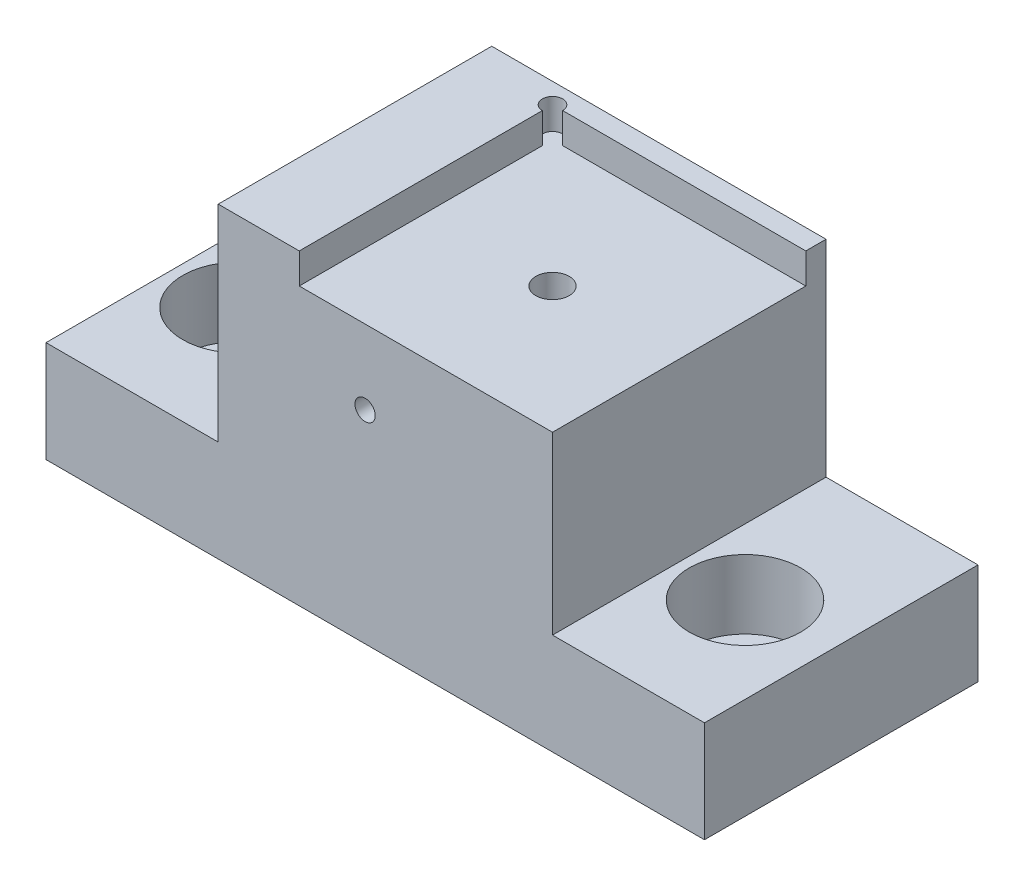
ISO-10303-21;
HEADER;
FILE_DESCRIPTION(('STEP AP214'),'2;1');
FILE_NAME('part.step','',(''),(''),'','','');
FILE_SCHEMA(('AUTOMOTIVE_DESIGN { 1 0 10303 214 1 1 1 1 }'));
ENDSEC;
DATA;
#1=APPLICATION_CONTEXT('core data for automotive mechanical design processes');
#2=APPLICATION_PROTOCOL_DEFINITION('international standard','automotive_design',2000,#1);
#3=PRODUCT_CONTEXT('',#1,'mechanical');
#4=PRODUCT('Part','Part','',(#3));
#5=PRODUCT_RELATED_PRODUCT_CATEGORY('part','',(#4));
#6=PRODUCT_DEFINITION_FORMATION('','',#4);
#7=PRODUCT_DEFINITION_CONTEXT('part definition',#1,'design');
#8=PRODUCT_DEFINITION('design','',#6,#7);
#9=PRODUCT_DEFINITION_SHAPE('','',#8);
#10=(LENGTH_UNIT() NAMED_UNIT(*) SI_UNIT(.MILLI.,.METRE.));
#11=(NAMED_UNIT(*) PLANE_ANGLE_UNIT() SI_UNIT($,.RADIAN.));
#12=(NAMED_UNIT(*) SI_UNIT($,.STERADIAN.) SOLID_ANGLE_UNIT());
#13=UNCERTAINTY_MEASURE_WITH_UNIT(LENGTH_MEASURE(1.E-05),#10,'distance_accuracy_value','');
#14=(GEOMETRIC_REPRESENTATION_CONTEXT(3) GLOBAL_UNCERTAINTY_ASSIGNED_CONTEXT((#13)) GLOBAL_UNIT_ASSIGNED_CONTEXT((#10,
#11,#12)) REPRESENTATION_CONTEXT('',''));
#15=CARTESIAN_POINT('',(0.,0.,0.));
#16=DIRECTION('',(0.,0.,1.));
#17=DIRECTION('',(1.,0.,0.));
#18=AXIS2_PLACEMENT_3D('',#15,#16,#17);
#19=CARTESIAN_POINT('',(-14.5,5.,-14.5));
#20=DIRECTION('',(0.,0.,1.));
#21=DIRECTION('',(1.,0.,0.));
#22=AXIS2_PLACEMENT_3D('',#19,#20,#21);
#23=PLANE('',#22);
#24=DIRECTION('',(1.,0.,0.));
#25=VECTOR('',#24,1.);
#26=CARTESIAN_POINT('',(14.5,-25.3411677323979,-14.5));
#27=LINE('',#26,#25);
#28=CARTESIAN_POINT('',(-37.5,-25.3411677323979,-14.5));
#29=VERTEX_POINT('',#28);
#30=CARTESIAN_POINT('',(27.5,-25.3411677323979,-14.5));
#31=VERTEX_POINT('',#30);
#32=EDGE_CURVE('E360',#29,#31,#27,.T.);
#33=ORIENTED_EDGE('',*,*,#32,.F.);
#34=DIRECTION('',(0.,-1.,0.));
#35=VECTOR('',#34,1.);
#36=CARTESIAN_POINT('',(-37.5,-15.3411677323979,-14.5));
#37=LINE('',#36,#35);
#38=CARTESIAN_POINT('',(-37.5,-15.3411677323979,-14.5));
#39=VERTEX_POINT('',#38);
#40=EDGE_CURVE('E249',#39,#29,#37,.T.);
#41=ORIENTED_EDGE('',*,*,#40,.F.);
#42=DIRECTION('',(-1.,0.,0.));
#43=VECTOR('',#42,1.);
#44=CARTESIAN_POINT('',(34.,-15.3411677323979,-14.5));
#45=LINE('',#44,#43);
#46=CARTESIAN_POINT('',(-20.5,-15.3411677323979,-14.5));
#47=VERTEX_POINT('',#46);
#48=EDGE_CURVE('E301',#47,#39,#45,.T.);
#49=ORIENTED_EDGE('',*,*,#48,.F.);
#50=DIRECTION('',(0.,1.,0.));
#51=VECTOR('',#50,1.);
#52=CARTESIAN_POINT('',(-20.5,-70.794440441852,-14.5));
#53=LINE('',#52,#51);
#54=CARTESIAN_POINT('',(-20.5,5.,-14.5));
#55=VERTEX_POINT('',#54);
#56=EDGE_CURVE('E359',#47,#55,#53,.T.);
#57=ORIENTED_EDGE('',*,*,#56,.T.);
#58=DIRECTION('',(-1.,0.,0.));
#59=VECTOR('',#58,1.);
#60=CARTESIAN_POINT('',(-14.5,5.,-14.5));
#61=LINE('',#60,#59);
#62=CARTESIAN_POINT('',(12.5,5.,-14.5));
#63=VERTEX_POINT('',#62);
#64=EDGE_CURVE('E50',#63,#55,#61,.T.);
#65=ORIENTED_EDGE('',*,*,#64,.F.);
#66=DIRECTION('',(0.,1.,0.));
#67=VECTOR('',#66,1.);
#68=CARTESIAN_POINT('',(12.5,-25.3411677323979,-14.5));
#69=LINE('',#68,#67);
#70=CARTESIAN_POINT('',(12.5,-15.3411677323979,-14.5));
#71=VERTEX_POINT('',#70);
#72=EDGE_CURVE('E331',#71,#63,#69,.T.);
#73=ORIENTED_EDGE('',*,*,#72,.F.);
#74=CARTESIAN_POINT('',(27.5,-15.3411677323979,-14.5));
#75=VERTEX_POINT('',#74);
#76=EDGE_CURVE('E302',#75,#71,#45,.T.);
#77=ORIENTED_EDGE('',*,*,#76,.F.);
#78=DIRECTION('',(0.,1.,0.));
#79=VECTOR('',#78,1.);
#80=CARTESIAN_POINT('',(27.5,-25.3411677323979,-14.5));
#81=LINE('',#80,#79);
#82=EDGE_CURVE('E66',#31,#75,#81,.T.);
#83=ORIENTED_EDGE('',*,*,#82,.F.);
#84=EDGE_LOOP('',(#33,#41,#49,#57,#65,#73,#77,#83));
#85=FACE_BOUND('',#84,.T.);
#86=ADVANCED_FACE('F42',(#85),#23,.F.);
#87=CARTESIAN_POINT('',(-20.5,-25.3411677323979,12.5));
#88=DIRECTION('',(0.,0.,-1.));
#89=DIRECTION('',(-1.,0.,0.));
#90=AXIS2_PLACEMENT_3D('',#87,#88,#89);
#91=PLANE('',#90);
#92=CARTESIAN_POINT('',(-6.,-5.34116773239792,12.5));
#93=DIRECTION('',(0.,0.,1.));
#94=DIRECTION('',(1.,0.,0.));
#95=AXIS2_PLACEMENT_3D('',#92,#93,#94);
#96=CIRCLE('',#95,1.0000000000003);
#97=CARTESIAN_POINT('',(-4.9999999999997,-5.34116773239792,12.5));
#98=VERTEX_POINT('',#97);
#99=EDGE_CURVE('E257',#98,#98,#96,.T.);
#100=ORIENTED_EDGE('',*,*,#99,.F.);
#101=EDGE_LOOP('',(#100));
#102=FACE_BOUND('',#101,.T.);
#103=DIRECTION('',(0.,1.,0.));
#104=VECTOR('',#103,1.);
#105=CARTESIAN_POINT('',(-37.5,-25.3411677323979,12.5));
#106=LINE('',#105,#104);
#107=CARTESIAN_POINT('',(-37.5,-25.3411677323979,12.5));
#108=VERTEX_POINT('',#107);
#109=CARTESIAN_POINT('',(-37.5,-15.3411677323979,12.5));
#110=VERTEX_POINT('',#109);
#111=EDGE_CURVE('E255',#108,#110,#106,.T.);
#112=ORIENTED_EDGE('',*,*,#111,.F.);
#113=DIRECTION('',(-1.,0.,0.));
#114=VECTOR('',#113,1.);
#115=CARTESIAN_POINT('',(-20.5,-25.3411677323979,12.5));
#116=LINE('',#115,#114);
#117=CARTESIAN_POINT('',(27.5,-25.3411677323979,12.5));
#118=VERTEX_POINT('',#117);
#119=EDGE_CURVE('E329',#118,#108,#116,.T.);
#120=ORIENTED_EDGE('',*,*,#119,.F.);
#121=DIRECTION('',(0.,-1.,0.));
#122=VECTOR('',#121,1.);
#123=CARTESIAN_POINT('',(27.5,-15.3411677323979,12.5));
#124=LINE('',#123,#122);
#125=CARTESIAN_POINT('',(27.5,-15.3411677323979,12.5));
#126=VERTEX_POINT('',#125);
#127=EDGE_CURVE('E239',#126,#118,#124,.T.);
#128=ORIENTED_EDGE('',*,*,#127,.F.);
#129=DIRECTION('',(-1.,0.,0.));
#130=VECTOR('',#129,1.);
#131=CARTESIAN_POINT('',(-46.,-15.3411677323979,12.5));
#132=LINE('',#131,#130);
#133=CARTESIAN_POINT('',(12.5,-15.3411677323979,12.5));
#134=VERTEX_POINT('',#133);
#135=EDGE_CURVE('E323',#126,#134,#132,.T.);
#136=ORIENTED_EDGE('',*,*,#135,.T.);
#137=DIRECTION('',(0.,1.,0.));
#138=VECTOR('',#137,1.);
#139=CARTESIAN_POINT('',(12.5,-25.3411677323979,12.5));
#140=LINE('',#139,#138);
#141=CARTESIAN_POINT('',(12.5,2.,12.5));
#142=VERTEX_POINT('',#141);
#143=EDGE_CURVE('E339',#134,#142,#140,.T.);
#144=ORIENTED_EDGE('',*,*,#143,.T.);
#145=DIRECTION('',(-1.,0.,0.));
#146=VECTOR('',#145,1.);
#147=CARTESIAN_POINT('',(-12.5,2.,12.5));
#148=LINE('',#147,#146);
#149=CARTESIAN_POINT('',(-12.5,2.,12.5));
#150=VERTEX_POINT('',#149);
#151=EDGE_CURVE('E367',#142,#150,#148,.T.);
#152=ORIENTED_EDGE('',*,*,#151,.T.);
#153=DIRECTION('',(0.,1.,0.));
#154=VECTOR('',#153,1.);
#155=CARTESIAN_POINT('',(-12.5,2.,12.5));
#156=LINE('',#155,#154);
#157=CARTESIAN_POINT('',(-12.5,5.,12.5));
#158=VERTEX_POINT('',#157);
#159=EDGE_CURVE('E383',#150,#158,#156,.T.);
#160=ORIENTED_EDGE('',*,*,#159,.T.);
#161=DIRECTION('',(-1.,0.,0.));
#162=VECTOR('',#161,1.);
#163=CARTESIAN_POINT('',(-20.5,5.,12.5));
#164=LINE('',#163,#162);
#165=CARTESIAN_POINT('',(-20.5,5.,12.5));
#166=VERTEX_POINT('',#165);
#167=EDGE_CURVE('E332',#158,#166,#164,.T.);
#168=ORIENTED_EDGE('',*,*,#167,.T.);
#169=DIRECTION('',(0.,1.,0.));
#170=VECTOR('',#169,1.);
#171=CARTESIAN_POINT('',(-20.5,-25.3411677323979,12.5));
#172=LINE('',#171,#170);
#173=CARTESIAN_POINT('',(-20.5,-15.3411677323979,12.5));
#174=VERTEX_POINT('',#173);
#175=EDGE_CURVE('E336',#174,#166,#172,.T.);
#176=ORIENTED_EDGE('',*,*,#175,.F.);
#177=EDGE_CURVE('E326',#174,#110,#132,.T.);
#178=ORIENTED_EDGE('',*,*,#177,.T.);
#179=EDGE_LOOP('',(#112,#120,#128,#136,#144,#152,#160,#168,#176,#178));
#180=FACE_BOUND('',#179,.T.);
#181=ADVANCED_FACE('F393',(#102,#180),#91,.F.);
#182=CARTESIAN_POINT('',(0.,-15.3411677323979,0.));
#183=DIRECTION('',(0.,-1.,0.));
#184=DIRECTION('',(0.,0.,-1.));
#185=AXIS2_PLACEMENT_3D('',#182,#183,#184);
#186=PLANE('',#185);
#187=CARTESIAN_POINT('',(19.,-15.3411677323979,0.));
#188=DIRECTION('',(0.,1.,0.));
#189=DIRECTION('',(0.,0.,1.));
#190=AXIS2_PLACEMENT_3D('',#187,#188,#189);
#191=CIRCLE('',#190,5.5);
#192=CARTESIAN_POINT('',(19.,-15.3411677323979,5.5));
#193=VERTEX_POINT('',#192);
#194=EDGE_CURVE('E313',#193,#193,#191,.T.);
#195=ORIENTED_EDGE('',*,*,#194,.F.);
#196=EDGE_LOOP('',(#195));
#197=FACE_BOUND('',#196,.T.);
#198=DIRECTION('',(0.,0.,1.));
#199=VECTOR('',#198,1.);
#200=CARTESIAN_POINT('',(27.5,-15.3411677323979,-14.5));
#201=LINE('',#200,#199);
#202=EDGE_CURVE('E245',#75,#126,#201,.T.);
#203=ORIENTED_EDGE('',*,*,#202,.F.);
#204=ORIENTED_EDGE('',*,*,#76,.T.);
#205=DIRECTION('',(0.,0.,1.));
#206=VECTOR('',#205,1.);
#207=CARTESIAN_POINT('',(12.5,-15.3411677323979,12.5));
#208=LINE('',#207,#206);
#209=EDGE_CURVE('E11',#71,#134,#208,.T.);
#210=ORIENTED_EDGE('',*,*,#209,.T.);
#211=ORIENTED_EDGE('',*,*,#135,.F.);
#212=EDGE_LOOP('',(#203,#204,#210,#211));
#213=FACE_BOUND('',#212,.T.);
#214=ADVANCED_FACE('F420',(#197,#213),#186,.F.);
#215=CARTESIAN_POINT('',(-6.0032,-25.3411677323979,-0.00319999999999834));
#216=DIRECTION('',(0.,-1.,0.));
#217=DIRECTION('',(0.,0.,-1.));
#218=AXIS2_PLACEMENT_3D('',#215,#216,#217);
#219=PLANE('',#218);
#220=DIRECTION('',(0.,0.,1.));
#221=VECTOR('',#220,1.);
#222=CARTESIAN_POINT('',(-37.5,-25.3411677323979,-14.5));
#223=LINE('',#222,#221);
#224=EDGE_CURVE('E252',#29,#108,#223,.T.);
#225=ORIENTED_EDGE('',*,*,#224,.F.);
#226=ORIENTED_EDGE('',*,*,#32,.T.);
#227=DIRECTION('',(0.,0.,-1.));
#228=VECTOR('',#227,1.);
#229=CARTESIAN_POINT('',(27.5,-25.3411677323979,12.5));
#230=LINE('',#229,#228);
#231=EDGE_CURVE('E242',#118,#31,#230,.T.);
#232=ORIENTED_EDGE('',*,*,#231,.F.);
#233=ORIENTED_EDGE('',*,*,#119,.T.);
#234=EDGE_LOOP('',(#225,#226,#232,#233));
#235=FACE_BOUND('',#234,.T.);
#236=CARTESIAN_POINT('',(-21.,-25.3411677323979,8.));
#237=DIRECTION('',(0.,-1.,0.));
#238=DIRECTION('',(0.,0.,-1.));
#239=AXIS2_PLACEMENT_3D('',#236,#237,#238);
#240=CIRCLE('',#239,1.99999999999999);
#241=CARTESIAN_POINT('',(-21.,-25.3411677323979,6.00000000000001));
#242=VERTEX_POINT('',#241);
#243=EDGE_CURVE('E203',#242,#242,#240,.T.);
#244=ORIENTED_EDGE('',*,*,#243,.F.);
#245=EDGE_LOOP('',(#244));
#246=FACE_BOUND('',#245,.T.);
#247=CARTESIAN_POINT('',(-21.,-25.3411677323979,-8.));
#248=DIRECTION('',(0.,-1.,0.));
#249=DIRECTION('',(0.,0.,-1.));
#250=AXIS2_PLACEMENT_3D('',#247,#248,#249);
#251=CIRCLE('',#250,2.);
#252=CARTESIAN_POINT('',(-21.,-25.3411677323979,-10.));
#253=VERTEX_POINT('',#252);
#254=EDGE_CURVE('E202',#253,#253,#251,.T.);
#255=ORIENTED_EDGE('',*,*,#254,.F.);
#256=EDGE_LOOP('',(#255));
#257=FACE_BOUND('',#256,.T.);
#258=CARTESIAN_POINT('',(-21.,-25.3411677323979,0.));
#259=DIRECTION('',(0.,-1.,0.));
#260=DIRECTION('',(0.,0.,-1.));
#261=AXIS2_PLACEMENT_3D('',#258,#259,#260);
#262=CIRCLE('',#261,2.);
#263=CARTESIAN_POINT('',(-21.,-25.3411677323979,-2.));
#264=VERTEX_POINT('',#263);
#265=EDGE_CURVE('E289',#264,#264,#262,.T.);
#266=ORIENTED_EDGE('',*,*,#265,.F.);
#267=EDGE_LOOP('',(#266));
#268=FACE_BOUND('',#267,.T.);
#269=CARTESIAN_POINT('',(-31.,-25.3411677323979,0.));
#270=DIRECTION('',(0.,-1.,0.));
#271=DIRECTION('',(0.,0.,-1.));
#272=AXIS2_PLACEMENT_3D('',#269,#270,#271);
#273=CIRCLE('',#272,3.3);
#274=CARTESIAN_POINT('',(-31.,-25.3411677323979,-3.3));
#275=VERTEX_POINT('',#274);
#276=EDGE_CURVE('E45',#275,#275,#273,.T.);
#277=ORIENTED_EDGE('',*,*,#276,.F.);
#278=EDGE_LOOP('',(#277));
#279=FACE_BOUND('',#278,.T.);
#280=CARTESIAN_POINT('',(8.5,-25.3411677323979,-8.));
#281=DIRECTION('',(0.,-1.,0.));
#282=DIRECTION('',(0.,0.,-1.));
#283=AXIS2_PLACEMENT_3D('',#280,#281,#282);
#284=CIRCLE('',#283,2.);
#285=CARTESIAN_POINT('',(8.5,-25.3411677323979,-6.));
#286=VERTEX_POINT('',#285);
#287=CARTESIAN_POINT('',(8.5,-25.3411677323979,-10.));
#288=VERTEX_POINT('',#287);
#289=EDGE_CURVE('E58',#286,#288,#284,.T.);
#290=ORIENTED_EDGE('',*,*,#289,.F.);
#291=DIRECTION('',(-1.,0.,0.));
#292=VECTOR('',#291,1.);
#293=CARTESIAN_POINT('',(8.5,-25.3411677323979,-6.));
#294=LINE('',#293,#292);
#295=CARTESIAN_POINT('',(9.5,-25.3411677323979,-6.));
#296=VERTEX_POINT('',#295);
#297=EDGE_CURVE('E228',#296,#286,#294,.T.);
#298=ORIENTED_EDGE('',*,*,#297,.F.);
#299=CARTESIAN_POINT('',(9.5,-25.3411677323979,-8.));
#300=DIRECTION('',(0.,-1.,0.));
#301=DIRECTION('',(0.,0.,-1.));
#302=AXIS2_PLACEMENT_3D('',#299,#300,#301);
#303=CIRCLE('',#302,2.);
#304=CARTESIAN_POINT('',(9.5,-25.3411677323979,-10.));
#305=VERTEX_POINT('',#304);
#306=EDGE_CURVE('E225',#305,#296,#303,.T.);
#307=ORIENTED_EDGE('',*,*,#306,.F.);
#308=DIRECTION('',(1.,0.,0.));
#309=VECTOR('',#308,1.);
#310=CARTESIAN_POINT('',(8.5,-25.3411677323979,-10.));
#311=LINE('',#310,#309);
#312=EDGE_CURVE('E222',#288,#305,#311,.T.);
#313=ORIENTED_EDGE('',*,*,#312,.F.);
#314=EDGE_LOOP('',(#290,#298,#307,#313));
#315=FACE_BOUND('',#314,.T.);
#316=CARTESIAN_POINT('',(19.,-25.3411677323979,0.));
#317=DIRECTION('',(0.,-1.,0.));
#318=DIRECTION('',(0.,0.,-1.));
#319=AXIS2_PLACEMENT_3D('',#316,#317,#318);
#320=CIRCLE('',#319,3.3);
#321=CARTESIAN_POINT('',(19.,-25.3411677323979,-3.3));
#322=VERTEX_POINT('',#321);
#323=EDGE_CURVE('E322',#322,#322,#320,.T.);
#324=ORIENTED_EDGE('',*,*,#323,.F.);
#325=EDGE_LOOP('',(#324));
#326=FACE_BOUND('',#325,.T.);
#327=CARTESIAN_POINT('',(8.5,-25.3411677323979,0.));
#328=DIRECTION('',(0.,-1.,0.));
#329=DIRECTION('',(0.,0.,-1.));
#330=AXIS2_PLACEMENT_3D('',#327,#328,#329);
#331=CIRCLE('',#330,2.);
#332=CARTESIAN_POINT('',(8.5,-25.3411677323979,2.));
#333=VERTEX_POINT('',#332);
#334=CARTESIAN_POINT('',(8.5,-25.3411677323979,-2.));
#335=VERTEX_POINT('',#334);
#336=EDGE_CURVE('E261',#333,#335,#331,.T.);
#337=ORIENTED_EDGE('',*,*,#336,.F.);
#338=DIRECTION('',(-1.,0.,0.));
#339=VECTOR('',#338,1.);
#340=CARTESIAN_POINT('',(8.5,-25.3411677323979,2.));
#341=LINE('',#340,#339);
#342=CARTESIAN_POINT('',(9.5,-25.3411677323979,2.));
#343=VERTEX_POINT('',#342);
#344=EDGE_CURVE('E268',#343,#333,#341,.T.);
#345=ORIENTED_EDGE('',*,*,#344,.F.);
#346=CARTESIAN_POINT('',(9.5,-25.3411677323979,0.));
#347=DIRECTION('',(0.,-1.,0.));
#348=DIRECTION('',(0.,0.,-1.));
#349=AXIS2_PLACEMENT_3D('',#346,#347,#348);
#350=CIRCLE('',#349,2.);
#351=CARTESIAN_POINT('',(9.5,-25.3411677323979,-2.));
#352=VERTEX_POINT('',#351);
#353=EDGE_CURVE('E282',#352,#343,#350,.T.);
#354=ORIENTED_EDGE('',*,*,#353,.F.);
#355=DIRECTION('',(1.,0.,0.));
#356=VECTOR('',#355,1.);
#357=CARTESIAN_POINT('',(8.5,-25.3411677323979,-2.));
#358=LINE('',#357,#356);
#359=EDGE_CURVE('E279',#335,#352,#358,.T.);
#360=ORIENTED_EDGE('',*,*,#359,.F.);
#361=EDGE_LOOP('',(#337,#345,#354,#360));
#362=FACE_BOUND('',#361,.T.);
#363=ADVANCED_FACE('F427',(#235,#246,#257,#268,#279,#315,#326,#362),#219,.T.);
#364=CARTESIAN_POINT('',(-31.,-15.3411677323979,0.));
#365=DIRECTION('',(0.,1.,0.));
#366=DIRECTION('',(0.,0.,1.));
#367=AXIS2_PLACEMENT_3D('',#364,#365,#366);
#368=CIRCLE('',#367,5.5);
#369=CARTESIAN_POINT('',(-31.,-15.3411677323979,5.5));
#370=VERTEX_POINT('',#369);
#371=EDGE_CURVE('E304',#370,#370,#368,.T.);
#372=ORIENTED_EDGE('',*,*,#371,.F.);
#373=EDGE_LOOP('',(#372));
#374=FACE_BOUND('',#373,.T.);
#375=DIRECTION('',(0.,0.,-1.));
#376=VECTOR('',#375,1.);
#377=CARTESIAN_POINT('',(-37.5,-15.3411677323979,12.5));
#378=LINE('',#377,#376);
#379=EDGE_CURVE('E247',#110,#39,#378,.T.);
#380=ORIENTED_EDGE('',*,*,#379,.F.);
#381=ORIENTED_EDGE('',*,*,#177,.F.);
#382=DIRECTION('',(0.,0.,-1.));
#383=VECTOR('',#382,1.);
#384=CARTESIAN_POINT('',(-20.5,-15.3411677323979,14.5));
#385=LINE('',#384,#383);
#386=EDGE_CURVE('E325',#174,#47,#385,.T.);
#387=ORIENTED_EDGE('',*,*,#386,.T.);
#388=ORIENTED_EDGE('',*,*,#48,.T.);
#389=EDGE_LOOP('',(#380,#381,#387,#388));
#390=FACE_BOUND('',#389,.T.);
#391=ADVANCED_FACE('F397',(#374,#390),#186,.F.);
#392=CARTESIAN_POINT('',(-20.5,-70.794440441852,14.5));
#393=DIRECTION('',(1.,0.,0.));
#394=DIRECTION('',(0.,0.,-1.));
#395=AXIS2_PLACEMENT_3D('',#392,#393,#394);
#396=PLANE('',#395);
#397=ORIENTED_EDGE('',*,*,#56,.F.);
#398=ORIENTED_EDGE('',*,*,#386,.F.);
#399=ORIENTED_EDGE('',*,*,#175,.T.);
#400=DIRECTION('',(0.,0.,1.));
#401=VECTOR('',#400,1.);
#402=CARTESIAN_POINT('',(-20.5,5.,14.5));
#403=LINE('',#402,#401);
#404=EDGE_CURVE('E338',#55,#166,#403,.T.);
#405=ORIENTED_EDGE('',*,*,#404,.F.);
#406=EDGE_LOOP('',(#397,#398,#399,#405));
#407=FACE_BOUND('',#406,.T.);
#408=ADVANCED_FACE('F402',(#407),#396,.F.);
#409=CARTESIAN_POINT('',(12.5,-25.3411677323979,12.5));
#410=DIRECTION('',(-1.,0.,0.));
#411=DIRECTION('',(0.,0.,1.));
#412=AXIS2_PLACEMENT_3D('',#409,#410,#411);
#413=PLANE('',#412);
#414=ORIENTED_EDGE('',*,*,#209,.F.);
#415=ORIENTED_EDGE('',*,*,#72,.T.);
#416=DIRECTION('',(0.,0.,1.));
#417=VECTOR('',#416,1.);
#418=CARTESIAN_POINT('',(12.5,5.,12.5));
#419=LINE('',#418,#417);
#420=CARTESIAN_POINT('',(12.5,5.,-12.5));
#421=VERTEX_POINT('',#420);
#422=EDGE_CURVE('E328',#63,#421,#419,.T.);
#423=ORIENTED_EDGE('',*,*,#422,.T.);
#424=DIRECTION('',(0.,1.,0.));
#425=VECTOR('',#424,1.);
#426=CARTESIAN_POINT('',(12.5,2.,-12.5));
#427=LINE('',#426,#425);
#428=CARTESIAN_POINT('',(12.5,2.,-12.5));
#429=VERTEX_POINT('',#428);
#430=EDGE_CURVE('E376',#429,#421,#427,.T.);
#431=ORIENTED_EDGE('',*,*,#430,.F.);
#432=DIRECTION('',(0.,0.,1.));
#433=VECTOR('',#432,1.);
#434=CARTESIAN_POINT('',(12.5,2.,12.5));
#435=LINE('',#434,#433);
#436=EDGE_CURVE('E364',#429,#142,#435,.T.);
#437=ORIENTED_EDGE('',*,*,#436,.T.);
#438=ORIENTED_EDGE('',*,*,#143,.F.);
#439=EDGE_LOOP('',(#414,#415,#423,#431,#437,#438));
#440=FACE_BOUND('',#439,.T.);
#441=ADVANCED_FACE('F416',(#440),#413,.F.);
#442=CARTESIAN_POINT('',(0.,5.,0.));
#443=DIRECTION('',(0.,1.,0.));
#444=DIRECTION('',(0.,0.,1.));
#445=AXIS2_PLACEMENT_3D('',#442,#443,#444);
#446=PLANE('',#445);
#447=ORIENTED_EDGE('',*,*,#167,.F.);
#448=DIRECTION('',(0.,0.,-1.));
#449=VECTOR('',#448,1.);
#450=CARTESIAN_POINT('',(-12.5,5.,12.5));
#451=LINE('',#450,#449);
#452=CARTESIAN_POINT('',(-12.5,5.,-11.5));
#453=VERTEX_POINT('',#452);
#454=EDGE_CURVE('E362',#158,#453,#451,.T.);
#455=ORIENTED_EDGE('',*,*,#454,.T.);
#456=CARTESIAN_POINT('',(-12.5,5.,-12.5));
#457=DIRECTION('',(0.,1.,0.));
#458=DIRECTION('',(0.,0.,1.));
#459=AXIS2_PLACEMENT_3D('',#456,#457,#458);
#460=CIRCLE('',#459,1.);
#461=CARTESIAN_POINT('',(-11.5,5.,-12.5));
#462=VERTEX_POINT('',#461);
#463=EDGE_CURVE('E344',#462,#453,#460,.T.);
#464=ORIENTED_EDGE('',*,*,#463,.F.);
#465=DIRECTION('',(1.,0.,0.));
#466=VECTOR('',#465,1.);
#467=CARTESIAN_POINT('',(-12.5,5.,-12.5));
#468=LINE('',#467,#466);
#469=EDGE_CURVE('E368',#462,#421,#468,.T.);
#470=ORIENTED_EDGE('',*,*,#469,.T.);
#471=ORIENTED_EDGE('',*,*,#422,.F.);
#472=ORIENTED_EDGE('',*,*,#64,.T.);
#473=ORIENTED_EDGE('',*,*,#404,.T.);
#474=EDGE_LOOP('',(#447,#455,#464,#470,#471,#472,#473));
#475=FACE_BOUND('',#474,.T.);
#476=ADVANCED_FACE('F411',(#475),#446,.T.);
#477=CARTESIAN_POINT('',(-12.5,2.,12.5));
#478=DIRECTION('',(1.,0.,0.));
#479=DIRECTION('',(0.,0.,-1.));
#480=AXIS2_PLACEMENT_3D('',#477,#478,#479);
#481=PLANE('',#480);
#482=DIRECTION('',(0.,1.,0.));
#483=VECTOR('',#482,1.);
#484=CARTESIAN_POINT('',(-12.5,-0.828427124746196,-11.5));
#485=LINE('',#484,#483);
#486=CARTESIAN_POINT('',(-12.5,2.,-11.5));
#487=VERTEX_POINT('',#486);
#488=EDGE_CURVE('E351',#453,#487,#485,.F.);
#489=ORIENTED_EDGE('',*,*,#488,.F.);
#490=ORIENTED_EDGE('',*,*,#454,.F.);
#491=ORIENTED_EDGE('',*,*,#159,.F.);
#492=DIRECTION('',(0.,0.,-1.));
#493=VECTOR('',#492,1.);
#494=CARTESIAN_POINT('',(-12.5,2.,12.5));
#495=LINE('',#494,#493);
#496=EDGE_CURVE('E370',#150,#487,#495,.T.);
#497=ORIENTED_EDGE('',*,*,#496,.T.);
#498=EDGE_LOOP('',(#489,#490,#491,#497));
#499=FACE_BOUND('',#498,.T.);
#500=ADVANCED_FACE('F483',(#499),#481,.T.);
#501=CARTESIAN_POINT('',(-12.5,2.,-12.5));
#502=DIRECTION('',(0.,0.,1.));
#503=DIRECTION('',(1.,0.,0.));
#504=AXIS2_PLACEMENT_3D('',#501,#502,#503);
#505=PLANE('',#504);
#506=DIRECTION('',(0.,1.,0.));
#507=VECTOR('',#506,1.);
#508=CARTESIAN_POINT('',(-11.5,-0.828427124746196,-12.5));
#509=LINE('',#508,#507);
#510=CARTESIAN_POINT('',(-11.5,2.,-12.5));
#511=VERTEX_POINT('',#510);
#512=EDGE_CURVE('E349',#511,#462,#509,.T.);
#513=ORIENTED_EDGE('',*,*,#512,.F.);
#514=DIRECTION('',(1.,0.,0.));
#515=VECTOR('',#514,1.);
#516=CARTESIAN_POINT('',(-12.5,2.,-12.5));
#517=LINE('',#516,#515);
#518=EDGE_CURVE('E373',#511,#429,#517,.T.);
#519=ORIENTED_EDGE('',*,*,#518,.T.);
#520=ORIENTED_EDGE('',*,*,#430,.T.);
#521=ORIENTED_EDGE('',*,*,#469,.F.);
#522=EDGE_LOOP('',(#513,#519,#520,#521));
#523=FACE_BOUND('',#522,.T.);
#524=ADVANCED_FACE('F479',(#523),#505,.T.);
#525=CARTESIAN_POINT('',(0.,2.,0.));
#526=DIRECTION('',(0.,-1.,0.));
#527=DIRECTION('',(0.,0.,-1.));
#528=AXIS2_PLACEMENT_3D('',#525,#526,#527);
#529=PLANE('',#528);
#530=CARTESIAN_POINT('',(0.,2.,0.));
#531=DIRECTION('',(0.,1.,0.));
#532=DIRECTION('',(0.,0.,1.));
#533=AXIS2_PLACEMENT_3D('',#530,#531,#532);
#534=CIRCLE('',#533,1.64999999999999);
#535=CARTESIAN_POINT('',(0.,2.,1.64999999999999));
#536=VERTEX_POINT('',#535);
#537=EDGE_CURVE('E353',#536,#536,#534,.T.);
#538=ORIENTED_EDGE('',*,*,#537,.F.);
#539=EDGE_LOOP('',(#538));
#540=FACE_BOUND('',#539,.T.);
#541=ORIENTED_EDGE('',*,*,#518,.F.);
#542=CARTESIAN_POINT('',(-12.5,2.,-12.5));
#543=DIRECTION('',(0.,-1.,0.));
#544=DIRECTION('',(0.,0.,-1.));
#545=AXIS2_PLACEMENT_3D('',#542,#543,#544);
#546=CIRCLE('',#545,1.);
#547=EDGE_CURVE('E346',#511,#487,#546,.F.);
#548=ORIENTED_EDGE('',*,*,#547,.T.);
#549=ORIENTED_EDGE('',*,*,#496,.F.);
#550=ORIENTED_EDGE('',*,*,#151,.F.);
#551=ORIENTED_EDGE('',*,*,#436,.F.);
#552=EDGE_LOOP('',(#541,#548,#549,#550,#551));
#553=FACE_BOUND('',#552,.T.);
#554=ADVANCED_FACE('F471',(#540,#553),#529,.F.);
#555=CARTESIAN_POINT('',(0.,-8.1,0.));
#556=DIRECTION('',(0.,1.,0.));
#557=DIRECTION('',(0.,0.,1.));
#558=AXIS2_PLACEMENT_3D('',#555,#556,#557);
#559=CONICAL_SURFACE('',#558,1.64999999999999,1.02974425867665);
#560=CARTESIAN_POINT('',(0.,-9.09142002139548,0.));
#561=VERTEX_POINT('',#560);
#562=VERTEX_LOOP('',#561);
#563=FACE_BOUND('',#562,.T.);
#564=CARTESIAN_POINT('',(0.,-8.1,0.));
#565=DIRECTION('',(0.,1.,0.));
#566=DIRECTION('',(0.,0.,1.));
#567=AXIS2_PLACEMENT_3D('',#564,#565,#566);
#568=CIRCLE('',#567,1.64999999999999);
#569=CARTESIAN_POINT('',(0.,-8.1,1.64999999999999));
#570=VERTEX_POINT('',#569);
#571=EDGE_CURVE('E356',#570,#570,#568,.T.);
#572=ORIENTED_EDGE('',*,*,#571,.T.);
#573=EDGE_LOOP('',(#572));
#574=FACE_BOUND('',#573,.T.);
#575=ADVANCED_FACE('F467',(#563,#574),#559,.F.);
#576=CARTESIAN_POINT('',(0.,2.,0.));
#577=DIRECTION('',(0.,1.,0.));
#578=DIRECTION('',(0.,0.,1.));
#579=AXIS2_PLACEMENT_3D('',#576,#577,#578);
#580=CYLINDRICAL_SURFACE('',#579,1.64999999999999);
#581=ORIENTED_EDGE('',*,*,#571,.F.);
#582=EDGE_LOOP('',(#581));
#583=FACE_BOUND('',#582,.T.);
#584=ORIENTED_EDGE('',*,*,#537,.T.);
#585=EDGE_LOOP('',(#584));
#586=FACE_BOUND('',#585,.T.);
#587=ADVANCED_FACE('F463',(#583,#586),#580,.F.);
#588=CARTESIAN_POINT('',(-12.5,-0.828427124746196,-12.5));
#589=DIRECTION('',(0.,1.,0.));
#590=DIRECTION('',(0.,0.,1.));
#591=AXIS2_PLACEMENT_3D('',#588,#589,#590);
#592=CYLINDRICAL_SURFACE('',#591,1.);
#593=ORIENTED_EDGE('',*,*,#488,.T.);
#594=ORIENTED_EDGE('',*,*,#547,.F.);
#595=ORIENTED_EDGE('',*,*,#512,.T.);
#596=ORIENTED_EDGE('',*,*,#463,.T.);
#597=EDGE_LOOP('',(#593,#594,#595,#596));
#598=FACE_BOUND('',#597,.T.);
#599=ADVANCED_FACE('F459',(#598),#592,.F.);
#600=CARTESIAN_POINT('',(19.,-15.3411677323979,0.));
#601=DIRECTION('',(0.,1.,0.));
#602=DIRECTION('',(0.,0.,1.));
#603=AXIS2_PLACEMENT_3D('',#600,#601,#602);
#604=CYLINDRICAL_SURFACE('',#603,3.3);
#605=ORIENTED_EDGE('',*,*,#323,.T.);
#606=EDGE_LOOP('',(#605));
#607=FACE_BOUND('',#606,.T.);
#608=CARTESIAN_POINT('',(19.,-22.1411677323979,0.));
#609=DIRECTION('',(0.,1.,0.));
#610=DIRECTION('',(0.,0.,1.));
#611=AXIS2_PLACEMENT_3D('',#608,#609,#610);
#612=CIRCLE('',#611,3.3);
#613=CARTESIAN_POINT('',(19.,-22.1411677323979,3.3));
#614=VERTEX_POINT('',#613);
#615=EDGE_CURVE('E319',#614,#614,#612,.T.);
#616=ORIENTED_EDGE('',*,*,#615,.T.);
#617=EDGE_LOOP('',(#616));
#618=FACE_BOUND('',#617,.T.);
#619=ADVANCED_FACE('F462',(#607,#618),#604,.F.);
#620=CARTESIAN_POINT('',(22.3,-22.1411677323979,0.));
#621=DIRECTION('',(0.,-1.,0.));
#622=DIRECTION('',(0.,0.,-1.));
#623=AXIS2_PLACEMENT_3D('',#620,#621,#622);
#624=PLANE('',#623);
#625=ORIENTED_EDGE('',*,*,#615,.F.);
#626=EDGE_LOOP('',(#625));
#627=FACE_BOUND('',#626,.T.);
#628=CARTESIAN_POINT('',(19.,-22.1411677323979,0.));
#629=DIRECTION('',(0.,1.,0.));
#630=DIRECTION('',(0.,0.,1.));
#631=AXIS2_PLACEMENT_3D('',#628,#629,#630);
#632=CIRCLE('',#631,5.5);
#633=CARTESIAN_POINT('',(19.,-22.1411677323979,5.5));
#634=VERTEX_POINT('',#633);
#635=EDGE_CURVE('E316',#634,#634,#632,.T.);
#636=ORIENTED_EDGE('',*,*,#635,.T.);
#637=EDGE_LOOP('',(#636));
#638=FACE_BOUND('',#637,.T.);
#639=ADVANCED_FACE('F523',(#627,#638),#624,.F.);
#640=CARTESIAN_POINT('',(19.,-15.3411677323979,0.));
#641=DIRECTION('',(0.,1.,0.));
#642=DIRECTION('',(0.,0.,1.));
#643=AXIS2_PLACEMENT_3D('',#640,#641,#642);
#644=CYLINDRICAL_SURFACE('',#643,5.5);
#645=ORIENTED_EDGE('',*,*,#635,.F.);
#646=EDGE_LOOP('',(#645));
#647=FACE_BOUND('',#646,.T.);
#648=ORIENTED_EDGE('',*,*,#194,.T.);
#649=EDGE_LOOP('',(#648));
#650=FACE_BOUND('',#649,.T.);
#651=ADVANCED_FACE('F529',(#647,#650),#644,.F.);
#652=CARTESIAN_POINT('',(-31.,-15.3411677323979,0.));
#653=DIRECTION('',(0.,1.,0.));
#654=DIRECTION('',(0.,0.,1.));
#655=AXIS2_PLACEMENT_3D('',#652,#653,#654);
#656=CYLINDRICAL_SURFACE('',#655,3.3);
#657=ORIENTED_EDGE('',*,*,#276,.T.);
#658=EDGE_LOOP('',(#657));
#659=FACE_BOUND('',#658,.T.);
#660=CARTESIAN_POINT('',(-31.,-22.1411677323979,0.));
#661=DIRECTION('',(0.,1.,0.));
#662=DIRECTION('',(0.,0.,1.));
#663=AXIS2_PLACEMENT_3D('',#660,#661,#662);
#664=CIRCLE('',#663,3.3);
#665=CARTESIAN_POINT('',(-31.,-22.1411677323979,3.3));
#666=VERTEX_POINT('',#665);
#667=EDGE_CURVE('E310',#666,#666,#664,.T.);
#668=ORIENTED_EDGE('',*,*,#667,.T.);
#669=EDGE_LOOP('',(#668));
#670=FACE_BOUND('',#669,.T.);
#671=ADVANCED_FACE('F537',(#659,#670),#656,.F.);
#672=CARTESIAN_POINT('',(-27.7,-22.1411677323979,0.));
#673=DIRECTION('',(0.,-1.,0.));
#674=DIRECTION('',(0.,0.,-1.));
#675=AXIS2_PLACEMENT_3D('',#672,#673,#674);
#676=PLANE('',#675);
#677=ORIENTED_EDGE('',*,*,#667,.F.);
#678=EDGE_LOOP('',(#677));
#679=FACE_BOUND('',#678,.T.);
#680=CARTESIAN_POINT('',(-31.,-22.1411677323979,0.));
#681=DIRECTION('',(0.,1.,0.));
#682=DIRECTION('',(0.,0.,1.));
#683=AXIS2_PLACEMENT_3D('',#680,#681,#682);
#684=CIRCLE('',#683,5.5);
#685=CARTESIAN_POINT('',(-31.,-22.1411677323979,5.5));
#686=VERTEX_POINT('',#685);
#687=EDGE_CURVE('E307',#686,#686,#684,.T.);
#688=ORIENTED_EDGE('',*,*,#687,.T.);
#689=EDGE_LOOP('',(#688));
#690=FACE_BOUND('',#689,.T.);
#691=ADVANCED_FACE('F545',(#679,#690),#676,.F.);
#692=CARTESIAN_POINT('',(-31.,-15.3411677323979,0.));
#693=DIRECTION('',(0.,1.,0.));
#694=DIRECTION('',(0.,0.,1.));
#695=AXIS2_PLACEMENT_3D('',#692,#693,#694);
#696=CYLINDRICAL_SURFACE('',#695,5.5);
#697=ORIENTED_EDGE('',*,*,#687,.F.);
#698=EDGE_LOOP('',(#697));
#699=FACE_BOUND('',#698,.T.);
#700=ORIENTED_EDGE('',*,*,#371,.T.);
#701=EDGE_LOOP('',(#700));
#702=FACE_BOUND('',#701,.T.);
#703=ADVANCED_FACE('F553',(#699,#702),#696,.F.);
#704=CARTESIAN_POINT('',(-21.,-20.3411677323979,0.));
#705=DIRECTION('',(0.,-1.,0.));
#706=DIRECTION('',(0.,0.,-1.));
#707=AXIS2_PLACEMENT_3D('',#704,#705,#706);
#708=CONICAL_SURFACE('',#707,2.,1.02974425867665);
#709=CARTESIAN_POINT('',(-21.,-19.1394464943428,0.));
#710=VERTEX_POINT('',#709);
#711=VERTEX_LOOP('',#710);
#712=FACE_BOUND('',#711,.T.);
#713=CARTESIAN_POINT('',(-21.,-20.3411677323979,0.));
#714=DIRECTION('',(0.,-1.,0.));
#715=DIRECTION('',(0.,0.,-1.));
#716=AXIS2_PLACEMENT_3D('',#713,#714,#715);
#717=CIRCLE('',#716,2.);
#718=CARTESIAN_POINT('',(-21.,-20.3411677323979,-2.));
#719=VERTEX_POINT('',#718);
#720=EDGE_CURVE('E298',#719,#719,#717,.T.);
#721=ORIENTED_EDGE('',*,*,#720,.T.);
#722=EDGE_LOOP('',(#721));
#723=FACE_BOUND('',#722,.T.);
#724=ADVANCED_FACE('F561',(#712,#723),#708,.F.);
#725=CARTESIAN_POINT('',(-21.,-25.3411677323979,0.));
#726=DIRECTION('',(0.,-1.,0.));
#727=DIRECTION('',(0.,0.,-1.));
#728=AXIS2_PLACEMENT_3D('',#725,#726,#727);
#729=CYLINDRICAL_SURFACE('',#728,2.);
#730=ORIENTED_EDGE('',*,*,#720,.F.);
#731=EDGE_LOOP('',(#730));
#732=FACE_BOUND('',#731,.T.);
#733=ORIENTED_EDGE('',*,*,#265,.T.);
#734=EDGE_LOOP('',(#733));
#735=FACE_BOUND('',#734,.T.);
#736=ADVANCED_FACE('F570',(#732,#735),#729,.F.);
#737=CARTESIAN_POINT('',(8.5,-20.3411677323979,0.));
#738=DIRECTION('',(0.,-1.,0.));
#739=DIRECTION('',(0.,0.,-1.));
#740=AXIS2_PLACEMENT_3D('',#737,#738,#739);
#741=CYLINDRICAL_SURFACE('',#740,2.);
#742=ORIENTED_EDGE('',*,*,#336,.T.);
#743=DIRECTION('',(0.,-1.,0.));
#744=VECTOR('',#743,1.);
#745=CARTESIAN_POINT('',(8.5,-20.3411677323979,-2.));
#746=LINE('',#745,#744);
#747=CARTESIAN_POINT('',(8.5,-20.3411677323979,-2.));
#748=VERTEX_POINT('',#747);
#749=EDGE_CURVE('E277',#748,#335,#746,.T.);
#750=ORIENTED_EDGE('',*,*,#749,.F.);
#751=CARTESIAN_POINT('',(8.5,-20.3411677323979,0.));
#752=DIRECTION('',(0.,-1.,0.));
#753=DIRECTION('',(0.,0.,-1.));
#754=AXIS2_PLACEMENT_3D('',#751,#752,#753);
#755=CIRCLE('',#754,2.);
#756=CARTESIAN_POINT('',(8.5,-20.3411677323979,2.));
#757=VERTEX_POINT('',#756);
#758=EDGE_CURVE('E264',#757,#748,#755,.T.);
#759=ORIENTED_EDGE('',*,*,#758,.F.);
#760=DIRECTION('',(0.,-1.,0.));
#761=VECTOR('',#760,1.);
#762=CARTESIAN_POINT('',(8.5,-20.3411677323979,2.));
#763=LINE('',#762,#761);
#764=EDGE_CURVE('E287',#757,#333,#763,.T.);
#765=ORIENTED_EDGE('',*,*,#764,.T.);
#766=EDGE_LOOP('',(#742,#750,#759,#765));
#767=FACE_BOUND('',#766,.T.);
#768=ADVANCED_FACE('F578',(#767),#741,.F.);
#769=CARTESIAN_POINT('',(8.5,-20.3411677323979,2.));
#770=DIRECTION('',(0.,0.,1.));
#771=DIRECTION('',(1.,0.,0.));
#772=AXIS2_PLACEMENT_3D('',#769,#770,#771);
#773=PLANE('',#772);
#774=ORIENTED_EDGE('',*,*,#344,.T.);
#775=ORIENTED_EDGE('',*,*,#764,.F.);
#776=DIRECTION('',(-1.,0.,0.));
#777=VECTOR('',#776,1.);
#778=CARTESIAN_POINT('',(8.5,-20.3411677323979,2.));
#779=LINE('',#778,#777);
#780=CARTESIAN_POINT('',(9.5,-20.3411677323979,2.));
#781=VERTEX_POINT('',#780);
#782=EDGE_CURVE('E274',#781,#757,#779,.T.);
#783=ORIENTED_EDGE('',*,*,#782,.F.);
#784=DIRECTION('',(0.,-1.,0.));
#785=VECTOR('',#784,1.);
#786=CARTESIAN_POINT('',(9.5,-20.3411677323979,2.));
#787=LINE('',#786,#785);
#788=EDGE_CURVE('E290',#781,#343,#787,.T.);
#789=ORIENTED_EDGE('',*,*,#788,.T.);
#790=EDGE_LOOP('',(#774,#775,#783,#789));
#791=FACE_BOUND('',#790,.T.);
#792=ADVANCED_FACE('F586',(#791),#773,.F.);
#793=CARTESIAN_POINT('',(9.5,-20.3411677323979,0.));
#794=DIRECTION('',(0.,-1.,0.));
#795=DIRECTION('',(0.,0.,-1.));
#796=AXIS2_PLACEMENT_3D('',#793,#794,#795);
#797=CYLINDRICAL_SURFACE('',#796,2.);
#798=ORIENTED_EDGE('',*,*,#353,.T.);
#799=ORIENTED_EDGE('',*,*,#788,.F.);
#800=CARTESIAN_POINT('',(9.5,-20.3411677323979,0.));
#801=DIRECTION('',(0.,-1.,0.));
#802=DIRECTION('',(0.,0.,-1.));
#803=AXIS2_PLACEMENT_3D('',#800,#801,#802);
#804=CIRCLE('',#803,2.);
#805=CARTESIAN_POINT('',(9.5,-20.3411677323979,-2.));
#806=VERTEX_POINT('',#805);
#807=EDGE_CURVE('E271',#806,#781,#804,.T.);
#808=ORIENTED_EDGE('',*,*,#807,.F.);
#809=DIRECTION('',(0.,-1.,0.));
#810=VECTOR('',#809,1.);
#811=CARTESIAN_POINT('',(9.5,-20.3411677323979,-2.));
#812=LINE('',#811,#810);
#813=EDGE_CURVE('E292',#806,#352,#812,.T.);
#814=ORIENTED_EDGE('',*,*,#813,.T.);
#815=EDGE_LOOP('',(#798,#799,#808,#814));
#816=FACE_BOUND('',#815,.T.);
#817=ADVANCED_FACE('F594',(#816),#797,.F.);
#818=CARTESIAN_POINT('',(8.5,-20.3411677323979,-2.));
#819=DIRECTION('',(0.,0.,-1.));
#820=DIRECTION('',(-1.,0.,0.));
#821=AXIS2_PLACEMENT_3D('',#818,#819,#820);
#822=PLANE('',#821);
#823=ORIENTED_EDGE('',*,*,#359,.T.);
#824=ORIENTED_EDGE('',*,*,#813,.F.);
#825=DIRECTION('',(1.,0.,0.));
#826=VECTOR('',#825,1.);
#827=CARTESIAN_POINT('',(8.5,-20.3411677323979,-2.));
#828=LINE('',#827,#826);
#829=EDGE_CURVE('E267',#748,#806,#828,.T.);
#830=ORIENTED_EDGE('',*,*,#829,.F.);
#831=ORIENTED_EDGE('',*,*,#749,.T.);
#832=EDGE_LOOP('',(#823,#824,#830,#831));
#833=FACE_BOUND('',#832,.T.);
#834=ADVANCED_FACE('F602',(#833),#822,.F.);
#835=CARTESIAN_POINT('',(8.5,-20.3411677323979,0.));
#836=DIRECTION('',(0.,-1.,0.));
#837=DIRECTION('',(0.,0.,-1.));
#838=AXIS2_PLACEMENT_3D('',#835,#836,#837);
#839=PLANE('',#838);
#840=ORIENTED_EDGE('',*,*,#758,.T.);
#841=ORIENTED_EDGE('',*,*,#829,.T.);
#842=ORIENTED_EDGE('',*,*,#807,.T.);
#843=ORIENTED_EDGE('',*,*,#782,.T.);
#844=EDGE_LOOP('',(#840,#841,#842,#843));
#845=FACE_BOUND('',#844,.T.);
#846=ADVANCED_FACE('F610',(#845),#839,.T.);
#847=CARTESIAN_POINT('',(-6.,-5.34116773239792,10.5));
#848=DIRECTION('',(0.,0.,1.));
#849=DIRECTION('',(1.,0.,0.));
#850=AXIS2_PLACEMENT_3D('',#847,#848,#849);
#851=CYLINDRICAL_SURFACE('',#850,1.0000000000003);
#852=CARTESIAN_POINT('',(-6.,-5.34116773239792,10.5));
#853=DIRECTION('',(0.,0.,1.));
#854=DIRECTION('',(1.,0.,0.));
#855=AXIS2_PLACEMENT_3D('',#852,#853,#854);
#856=CIRCLE('',#855,1.0000000000003);
#857=CARTESIAN_POINT('',(-4.9999999999997,-5.34116773239792,10.5));
#858=VERTEX_POINT('',#857);
#859=EDGE_CURVE('E258',#858,#858,#856,.T.);
#860=ORIENTED_EDGE('',*,*,#859,.F.);
#861=EDGE_LOOP('',(#860));
#862=FACE_BOUND('',#861,.T.);
#863=ORIENTED_EDGE('',*,*,#99,.T.);
#864=EDGE_LOOP('',(#863));
#865=FACE_BOUND('',#864,.T.);
#866=ADVANCED_FACE('F440',(#862,#865),#851,.F.);
#867=CARTESIAN_POINT('',(-6.,-5.34116773239792,10.5));
#868=DIRECTION('',(0.,0.,1.));
#869=DIRECTION('',(1.,0.,0.));
#870=AXIS2_PLACEMENT_3D('',#867,#868,#869);
#871=PLANE('',#870);
#872=ORIENTED_EDGE('',*,*,#859,.T.);
#873=EDGE_LOOP('',(#872));
#874=FACE_BOUND('',#873,.T.);
#875=ADVANCED_FACE('F432',(#874),#871,.T.);
#876=CARTESIAN_POINT('',(-37.5,0.,0.));
#877=DIRECTION('',(-1.,0.,0.));
#878=DIRECTION('',(0.,0.,1.));
#879=AXIS2_PLACEMENT_3D('',#876,#877,#878);
#880=PLANE('',#879);
#881=ORIENTED_EDGE('',*,*,#379,.T.);
#882=ORIENTED_EDGE('',*,*,#40,.T.);
#883=ORIENTED_EDGE('',*,*,#224,.T.);
#884=ORIENTED_EDGE('',*,*,#111,.T.);
#885=EDGE_LOOP('',(#881,#882,#883,#884));
#886=FACE_BOUND('',#885,.T.);
#887=ADVANCED_FACE('F430',(#886),#880,.T.);
#888=CARTESIAN_POINT('',(27.5,0.,0.));
#889=DIRECTION('',(1.,0.,0.));
#890=DIRECTION('',(0.,0.,-1.));
#891=AXIS2_PLACEMENT_3D('',#888,#889,#890);
#892=PLANE('',#891);
#893=ORIENTED_EDGE('',*,*,#127,.T.);
#894=ORIENTED_EDGE('',*,*,#231,.T.);
#895=ORIENTED_EDGE('',*,*,#82,.T.);
#896=ORIENTED_EDGE('',*,*,#202,.T.);
#897=EDGE_LOOP('',(#893,#894,#895,#896));
#898=FACE_BOUND('',#897,.T.);
#899=ADVANCED_FACE('F423',(#898),#892,.T.);
#900=CARTESIAN_POINT('',(8.5,-13.9380434949651,-8.));
#901=DIRECTION('',(0.,-1.,0.));
#902=DIRECTION('',(0.,0.,-1.));
#903=AXIS2_PLACEMENT_3D('',#900,#901,#902);
#904=CYLINDRICAL_SURFACE('',#903,2.);
#905=CARTESIAN_POINT('',(8.5,-20.3411677323979,-8.));
#906=DIRECTION('',(0.,-1.,0.));
#907=DIRECTION('',(0.,0.,-1.));
#908=AXIS2_PLACEMENT_3D('',#905,#906,#907);
#909=CIRCLE('',#908,2.);
#910=CARTESIAN_POINT('',(8.5,-20.3411677323979,-10.));
#911=VERTEX_POINT('',#910);
#912=CARTESIAN_POINT('',(8.5,-20.3411677323979,-6.));
#913=VERTEX_POINT('',#912);
#914=EDGE_CURVE('E218',#911,#913,#909,.F.);
#915=ORIENTED_EDGE('',*,*,#914,.T.);
#916=DIRECTION('',(0.,-1.,0.));
#917=VECTOR('',#916,1.);
#918=CARTESIAN_POINT('',(8.5,-13.9380434949651,-6.));
#919=LINE('',#918,#917);
#920=EDGE_CURVE('E216',#913,#286,#919,.T.);
#921=ORIENTED_EDGE('',*,*,#920,.T.);
#922=ORIENTED_EDGE('',*,*,#289,.T.);
#923=DIRECTION('',(0.,-1.,0.));
#924=VECTOR('',#923,1.);
#925=CARTESIAN_POINT('',(8.5,-13.9380434949651,-10.));
#926=LINE('',#925,#924);
#927=EDGE_CURVE('E231',#911,#288,#926,.T.);
#928=ORIENTED_EDGE('',*,*,#927,.F.);
#929=EDGE_LOOP('',(#915,#921,#922,#928));
#930=FACE_BOUND('',#929,.T.);
#931=ADVANCED_FACE('F438',(#930),#904,.F.);
#932=CARTESIAN_POINT('',(8.5,-13.9380434949651,-6.));
#933=DIRECTION('',(0.,0.,1.));
#934=DIRECTION('',(1.,0.,0.));
#935=AXIS2_PLACEMENT_3D('',#932,#933,#934);
#936=PLANE('',#935);
#937=DIRECTION('',(1.,0.,0.));
#938=VECTOR('',#937,1.);
#939=CARTESIAN_POINT('',(8.5,-20.3411677323979,-6.));
#940=LINE('',#939,#938);
#941=CARTESIAN_POINT('',(9.5,-20.3411677323979,-6.));
#942=VERTEX_POINT('',#941);
#943=EDGE_CURVE('E215',#913,#942,#940,.T.);
#944=ORIENTED_EDGE('',*,*,#943,.T.);
#945=DIRECTION('',(0.,-1.,0.));
#946=VECTOR('',#945,1.);
#947=CARTESIAN_POINT('',(9.5,-13.9380434949651,-6.));
#948=LINE('',#947,#946);
#949=EDGE_CURVE('E233',#942,#296,#948,.T.);
#950=ORIENTED_EDGE('',*,*,#949,.T.);
#951=ORIENTED_EDGE('',*,*,#297,.T.);
#952=ORIENTED_EDGE('',*,*,#920,.F.);
#953=EDGE_LOOP('',(#944,#950,#951,#952));
#954=FACE_BOUND('',#953,.T.);
#955=ADVANCED_FACE('F669',(#954),#936,.F.);
#956=CARTESIAN_POINT('',(9.5,-13.9380434949651,-8.));
#957=DIRECTION('',(0.,-1.,0.));
#958=DIRECTION('',(0.,0.,-1.));
#959=AXIS2_PLACEMENT_3D('',#956,#957,#958);
#960=CYLINDRICAL_SURFACE('',#959,2.);
#961=CARTESIAN_POINT('',(9.5,-20.3411677323979,-8.));
#962=DIRECTION('',(0.,-1.,0.));
#963=DIRECTION('',(0.,0.,-1.));
#964=AXIS2_PLACEMENT_3D('',#961,#962,#963);
#965=CIRCLE('',#964,2.);
#966=CARTESIAN_POINT('',(9.5,-20.3411677323979,-10.));
#967=VERTEX_POINT('',#966);
#968=EDGE_CURVE('E213',#942,#967,#965,.F.);
#969=ORIENTED_EDGE('',*,*,#968,.T.);
#970=DIRECTION('',(0.,-1.,0.));
#971=VECTOR('',#970,1.);
#972=CARTESIAN_POINT('',(9.5,-13.9380434949651,-10.));
#973=LINE('',#972,#971);
#974=EDGE_CURVE('E235',#967,#305,#973,.T.);
#975=ORIENTED_EDGE('',*,*,#974,.T.);
#976=ORIENTED_EDGE('',*,*,#306,.T.);
#977=ORIENTED_EDGE('',*,*,#949,.F.);
#978=EDGE_LOOP('',(#969,#975,#976,#977));
#979=FACE_BOUND('',#978,.T.);
#980=ADVANCED_FACE('F678',(#979),#960,.F.);
#981=CARTESIAN_POINT('',(8.5,-13.9380434949651,-10.));
#982=DIRECTION('',(0.,0.,-1.));
#983=DIRECTION('',(-1.,0.,0.));
#984=AXIS2_PLACEMENT_3D('',#981,#982,#983);
#985=PLANE('',#984);
#986=DIRECTION('',(-1.,0.,0.));
#987=VECTOR('',#986,1.);
#988=CARTESIAN_POINT('',(8.5,-20.3411677323979,-10.));
#989=LINE('',#988,#987);
#990=EDGE_CURVE('E220',#967,#911,#989,.T.);
#991=ORIENTED_EDGE('',*,*,#990,.T.);
#992=ORIENTED_EDGE('',*,*,#927,.T.);
#993=ORIENTED_EDGE('',*,*,#312,.T.);
#994=ORIENTED_EDGE('',*,*,#974,.F.);
#995=EDGE_LOOP('',(#991,#992,#993,#994));
#996=FACE_BOUND('',#995,.T.);
#997=ADVANCED_FACE('F688',(#996),#985,.F.);
#998=CARTESIAN_POINT('',(8.5,-20.3411677323979,0.));
#999=DIRECTION('',(0.,-1.,0.));
#1000=DIRECTION('',(0.,0.,-1.));
#1001=AXIS2_PLACEMENT_3D('',#998,#999,#1000);
#1002=PLANE('',#1001);
#1003=ORIENTED_EDGE('',*,*,#914,.F.);
#1004=ORIENTED_EDGE('',*,*,#990,.F.);
#1005=ORIENTED_EDGE('',*,*,#968,.F.);
#1006=ORIENTED_EDGE('',*,*,#943,.F.);
#1007=EDGE_LOOP('',(#1003,#1004,#1005,#1006));
#1008=FACE_BOUND('',#1007,.T.);
#1009=ADVANCED_FACE('F698',(#1008),#1002,.T.);
#1010=CARTESIAN_POINT('',(-21.,-20.3411677323979,-8.));
#1011=DIRECTION('',(0.,-1.,0.));
#1012=DIRECTION('',(0.,0.,-1.));
#1013=AXIS2_PLACEMENT_3D('',#1010,#1011,#1012);
#1014=CONICAL_SURFACE('',#1013,2.,1.02974425867665);
#1015=CARTESIAN_POINT('',(-21.,-19.1394464943428,-8.));
#1016=VERTEX_POINT('',#1015);
#1017=VERTEX_LOOP('',#1016);
#1018=FACE_BOUND('',#1017,.T.);
#1019=CARTESIAN_POINT('',(-21.,-20.3411677323979,-8.));
#1020=DIRECTION('',(0.,-1.,0.));
#1021=DIRECTION('',(0.,0.,-1.));
#1022=AXIS2_PLACEMENT_3D('',#1019,#1020,#1021);
#1023=CIRCLE('',#1022,2.);
#1024=CARTESIAN_POINT('',(-21.,-20.3411677323979,-10.));
#1025=VERTEX_POINT('',#1024);
#1026=EDGE_CURVE('E206',#1025,#1025,#1023,.T.);
#1027=ORIENTED_EDGE('',*,*,#1026,.T.);
#1028=EDGE_LOOP('',(#1027));
#1029=FACE_BOUND('',#1028,.T.);
#1030=ADVANCED_FACE('F708',(#1018,#1029),#1014,.F.);
#1031=CARTESIAN_POINT('',(-21.,-25.3411677323979,-8.));
#1032=DIRECTION('',(0.,-1.,0.));
#1033=DIRECTION('',(0.,0.,-1.));
#1034=AXIS2_PLACEMENT_3D('',#1031,#1032,#1033);
#1035=CYLINDRICAL_SURFACE('',#1034,2.);
#1036=ORIENTED_EDGE('',*,*,#1026,.F.);
#1037=EDGE_LOOP('',(#1036));
#1038=FACE_BOUND('',#1037,.T.);
#1039=ORIENTED_EDGE('',*,*,#254,.T.);
#1040=EDGE_LOOP('',(#1039));
#1041=FACE_BOUND('',#1040,.T.);
#1042=ADVANCED_FACE('F196',(#1038,#1041),#1035,.F.);
#1043=CARTESIAN_POINT('',(-21.,-20.3411677323979,8.));
#1044=DIRECTION('',(0.,-1.,0.));
#1045=DIRECTION('',(0.,0.,-1.));
#1046=AXIS2_PLACEMENT_3D('',#1043,#1044,#1045);
#1047=CONICAL_SURFACE('',#1046,1.99999999999999,1.02974425867665);
#1048=CARTESIAN_POINT('',(-21.,-19.1394464943428,8.));
#1049=VERTEX_POINT('',#1048);
#1050=VERTEX_LOOP('',#1049);
#1051=FACE_BOUND('',#1050,.T.);
#1052=CARTESIAN_POINT('',(-21.,-20.3411677323979,8.));
#1053=DIRECTION('',(0.,-1.,0.));
#1054=DIRECTION('',(0.,0.,-1.));
#1055=AXIS2_PLACEMENT_3D('',#1052,#1053,#1054);
#1056=CIRCLE('',#1055,1.99999999999999);
#1057=CARTESIAN_POINT('',(-21.,-20.3411677323979,6.00000000000001));
#1058=VERTEX_POINT('',#1057);
#1059=EDGE_CURVE('E200',#1058,#1058,#1056,.T.);
#1060=ORIENTED_EDGE('',*,*,#1059,.T.);
#1061=EDGE_LOOP('',(#1060));
#1062=FACE_BOUND('',#1061,.T.);
#1063=ADVANCED_FACE('F192',(#1051,#1062),#1047,.F.);
#1064=CARTESIAN_POINT('',(-21.,-25.3411677323979,8.));
#1065=DIRECTION('',(0.,-1.,0.));
#1066=DIRECTION('',(0.,0.,-1.));
#1067=AXIS2_PLACEMENT_3D('',#1064,#1065,#1066);
#1068=CYLINDRICAL_SURFACE('',#1067,1.99999999999999);
#1069=ORIENTED_EDGE('',*,*,#1059,.F.);
#1070=EDGE_LOOP('',(#1069));
#1071=FACE_BOUND('',#1070,.T.);
#1072=ORIENTED_EDGE('',*,*,#243,.T.);
#1073=EDGE_LOOP('',(#1072));
#1074=FACE_BOUND('',#1073,.T.);
#1075=ADVANCED_FACE('F195',(#1071,#1074),#1068,.F.);
#1076=CLOSED_SHELL('',(#86,#181,#214,#363,#391,#408,#441,#476,#500,#524,#554,#575,#587,#599,
#619,#639,#651,#671,#691,#703,#724,#736,#768,#792,#817,#834,#846,#866,#875,#887,#899,#931,#955,
#980,#997,#1009,#1030,#1042,#1063,#1075));
#1077=MANIFOLD_SOLID_BREP('B2',#1076);
#1078=ADVANCED_BREP_SHAPE_REPRESENTATION('',(#18,#1077),#14);
#1079=SHAPE_DEFINITION_REPRESENTATION(#9,#1078);
ENDSEC;
END-ISO-10303-21;
